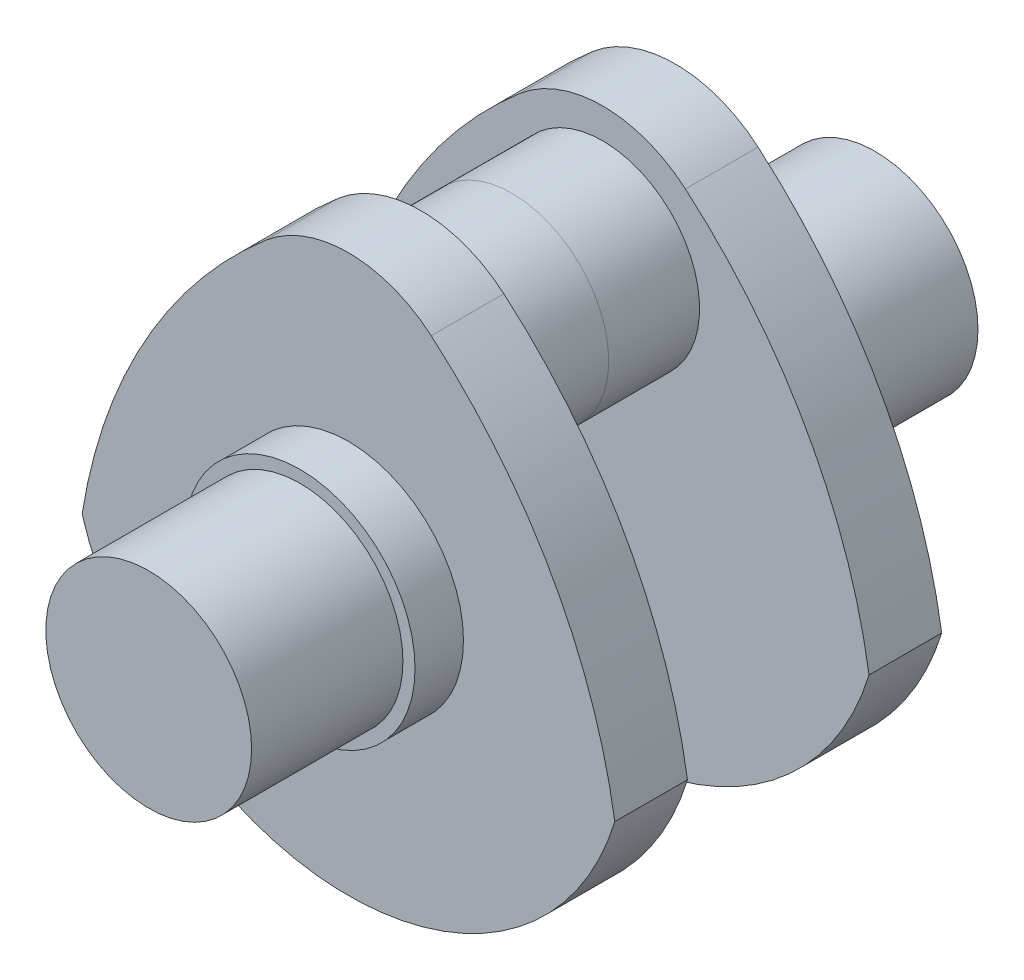
ISO-10303-21;
HEADER;
FILE_DESCRIPTION(('STEP AP214'),'2;1');
FILE_NAME('part.step','',(''),(''),'','','');
FILE_SCHEMA(('AUTOMOTIVE_DESIGN { 1 0 10303 214 1 1 1 1 }'));
ENDSEC;
DATA;
#1=APPLICATION_CONTEXT('core data for automotive mechanical design processes');
#2=APPLICATION_PROTOCOL_DEFINITION('international standard','automotive_design',2000,#1);
#3=PRODUCT_CONTEXT('',#1,'mechanical');
#4=PRODUCT('Part','Part','',(#3));
#5=PRODUCT_RELATED_PRODUCT_CATEGORY('part','',(#4));
#6=PRODUCT_DEFINITION_FORMATION('','',#4);
#7=PRODUCT_DEFINITION_CONTEXT('part definition',#1,'design');
#8=PRODUCT_DEFINITION('design','',#6,#7);
#9=PRODUCT_DEFINITION_SHAPE('','',#8);
#10=(LENGTH_UNIT() NAMED_UNIT(*) SI_UNIT(.MILLI.,.METRE.));
#11=(NAMED_UNIT(*) PLANE_ANGLE_UNIT() SI_UNIT($,.RADIAN.));
#12=(NAMED_UNIT(*) SI_UNIT($,.STERADIAN.) SOLID_ANGLE_UNIT());
#13=UNCERTAINTY_MEASURE_WITH_UNIT(LENGTH_MEASURE(1.E-05),#10,'distance_accuracy_value','');
#14=(GEOMETRIC_REPRESENTATION_CONTEXT(3) GLOBAL_UNCERTAINTY_ASSIGNED_CONTEXT((#13)) GLOBAL_UNIT_ASSIGNED_CONTEXT((#10,
#11,#12)) REPRESENTATION_CONTEXT('',''));
#15=CARTESIAN_POINT('',(0.,0.,0.));
#16=DIRECTION('',(0.,0.,1.));
#17=DIRECTION('',(1.,0.,0.));
#18=AXIS2_PLACEMENT_3D('',#15,#16,#17);
#19=CARTESIAN_POINT('',(0.,0.,-87.));
#20=DIRECTION('',(0.,0.,1.));
#21=DIRECTION('',(-1.,0.,0.));
#22=AXIS2_PLACEMENT_3D('',#19,#20,#21);
#23=CYLINDRICAL_SURFACE('',#22,17.);
#24=CARTESIAN_POINT('',(0.,0.,-62.));
#25=DIRECTION('',(0.,0.,1.));
#26=DIRECTION('',(1.,0.,0.));
#27=AXIS2_PLACEMENT_3D('',#24,#25,#26);
#28=CIRCLE('',#27,17.);
#29=CARTESIAN_POINT('',(17.,0.,-62.));
#30=VERTEX_POINT('',#29);
#31=EDGE_CURVE('E50',#30,#30,#28,.T.);
#32=ORIENTED_EDGE('',*,*,#31,.F.);
#33=EDGE_LOOP('',(#32));
#34=FACE_BOUND('',#33,.T.);
#35=CARTESIAN_POINT('',(0.,0.,-87.));
#36=DIRECTION('',(0.,0.,1.));
#37=DIRECTION('',(1.,0.,0.));
#38=AXIS2_PLACEMENT_3D('',#35,#36,#37);
#39=CIRCLE('',#38,17.);
#40=CARTESIAN_POINT('',(17.,0.,-87.));
#41=VERTEX_POINT('',#40);
#42=EDGE_CURVE('E12',#41,#41,#39,.T.);
#43=ORIENTED_EDGE('',*,*,#42,.T.);
#44=EDGE_LOOP('',(#43));
#45=FACE_BOUND('',#44,.T.);
#46=ADVANCED_FACE('F47',(#34,#45),#23,.T.);
#47=CARTESIAN_POINT('',(0.,0.,-87.));
#48=DIRECTION('',(0.,0.,-1.));
#49=DIRECTION('',(1.,0.,0.));
#50=AXIS2_PLACEMENT_3D('',#47,#48,#49);
#51=PLANE('',#50);
#52=ORIENTED_EDGE('',*,*,#42,.F.);
#53=EDGE_LOOP('',(#52));
#54=FACE_BOUND('',#53,.T.);
#55=ADVANCED_FACE('F137',(#54),#51,.T.);
#56=CARTESIAN_POINT('',(0.,0.,-62.));
#57=DIRECTION('',(0.,0.,1.));
#58=DIRECTION('',(-1.,0.,0.));
#59=AXIS2_PLACEMENT_3D('',#56,#57,#58);
#60=CYLINDRICAL_SURFACE('',#59,19.);
#61=CARTESIAN_POINT('',(0.,0.,-62.));
#62=DIRECTION('',(0.,0.,1.));
#63=DIRECTION('',(1.,0.,0.));
#64=AXIS2_PLACEMENT_3D('',#61,#62,#63);
#65=CIRCLE('',#64,19.);
#66=CARTESIAN_POINT('',(19.,0.,-62.));
#67=VERTEX_POINT('',#66);
#68=EDGE_CURVE('E126',#67,#67,#65,.T.);
#69=ORIENTED_EDGE('',*,*,#68,.T.);
#70=EDGE_LOOP('',(#69));
#71=FACE_BOUND('',#70,.T.);
#72=CARTESIAN_POINT('',(0.,0.,-54.));
#73=DIRECTION('',(0.,0.,1.));
#74=DIRECTION('',(1.,0.,0.));
#75=AXIS2_PLACEMENT_3D('',#72,#73,#74);
#76=CIRCLE('',#75,19.);
#77=CARTESIAN_POINT('',(19.,0.,-54.));
#78=VERTEX_POINT('',#77);
#79=EDGE_CURVE('E125',#78,#78,#76,.T.);
#80=ORIENTED_EDGE('',*,*,#79,.F.);
#81=EDGE_LOOP('',(#80));
#82=FACE_BOUND('',#81,.T.);
#83=ADVANCED_FACE('F134',(#71,#82),#60,.T.);
#84=CARTESIAN_POINT('',(0.,0.,-62.));
#85=DIRECTION('',(0.,0.,-1.));
#86=DIRECTION('',(1.,0.,0.));
#87=AXIS2_PLACEMENT_3D('',#84,#85,#86);
#88=PLANE('',#87);
#89=ORIENTED_EDGE('',*,*,#31,.T.);
#90=EDGE_LOOP('',(#89));
#91=FACE_BOUND('',#90,.T.);
#92=ORIENTED_EDGE('',*,*,#68,.F.);
#93=EDGE_LOOP('',(#92));
#94=FACE_BOUND('',#93,.T.);
#95=ADVANCED_FACE('F136',(#91,#94),#88,.T.);
#96=CARTESIAN_POINT('',(-44.9094542035734,-27.3845485151599,-42.));
#97=DIRECTION('',(0.,0.,-1.));
#98=DIRECTION('',(1.,0.,0.));
#99=AXIS2_PLACEMENT_3D('',#96,#97,#98);
#100=CYLINDRICAL_SURFACE('',#99,90.);
#101=CARTESIAN_POINT('',(-44.9094542035734,-27.3845485151599,-54.));
#102=DIRECTION('',(0.,0.,-1.));
#103=DIRECTION('',(-1.,0.,0.));
#104=AXIS2_PLACEMENT_3D('',#101,#102,#103);
#105=CIRCLE('',#104,90.);
#106=CARTESIAN_POINT('',(13.6680947576093,40.9431234611356,-54.));
#107=VERTEX_POINT('',#106);
#108=CARTESIAN_POINT('',(44.,-13.4164078649987,-54.));
#109=VERTEX_POINT('',#108);
#110=EDGE_CURVE('E115',#107,#109,#105,.T.);
#111=ORIENTED_EDGE('',*,*,#110,.F.);
#112=DIRECTION('',(0.,0.,-1.));
#113=VECTOR('',#112,1.);
#114=CARTESIAN_POINT('',(13.6680947576093,40.9431234611356,-42.));
#115=LINE('',#114,#113);
#116=CARTESIAN_POINT('',(13.6680947576093,40.9431234611356,-42.));
#117=VERTEX_POINT('',#116);
#118=EDGE_CURVE('E114',#117,#107,#115,.T.);
#119=ORIENTED_EDGE('',*,*,#118,.F.);
#120=CARTESIAN_POINT('',(-44.9094542035734,-27.3845485151599,-42.));
#121=DIRECTION('',(0.,0.,-1.));
#122=DIRECTION('',(-1.,0.,0.));
#123=AXIS2_PLACEMENT_3D('',#120,#121,#122);
#124=CIRCLE('',#123,90.);
#125=CARTESIAN_POINT('',(44.,-13.4164078649987,-42.));
#126=VERTEX_POINT('',#125);
#127=EDGE_CURVE('E108',#117,#126,#124,.T.);
#128=ORIENTED_EDGE('',*,*,#127,.T.);
#129=DIRECTION('',(0.,0.,-1.));
#130=VECTOR('',#129,1.);
#131=CARTESIAN_POINT('',(44.,-13.4164078649987,-42.));
#132=LINE('',#131,#130);
#133=EDGE_CURVE('E102',#126,#109,#132,.T.);
#134=ORIENTED_EDGE('',*,*,#133,.T.);
#135=EDGE_LOOP('',(#111,#119,#128,#134));
#136=FACE_BOUND('',#135,.T.);
#137=ADVANCED_FACE('F144',(#136),#100,.T.);
#138=CARTESIAN_POINT('',(0.,0.,-42.));
#139=DIRECTION('',(0.,0.,-1.));
#140=DIRECTION('',(1.,0.,0.));
#141=AXIS2_PLACEMENT_3D('',#138,#139,#140);
#142=CYLINDRICAL_SURFACE('',#141,46.);
#143=CARTESIAN_POINT('',(0.,0.,-54.));
#144=DIRECTION('',(0.,0.,-1.));
#145=DIRECTION('',(-1.,0.,0.));
#146=AXIS2_PLACEMENT_3D('',#143,#144,#145);
#147=CIRCLE('',#146,46.);
#148=CARTESIAN_POINT('',(-44.,-13.4164078649987,-54.));
#149=VERTEX_POINT('',#148);
#150=EDGE_CURVE('E117',#109,#149,#147,.T.);
#151=ORIENTED_EDGE('',*,*,#150,.F.);
#152=ORIENTED_EDGE('',*,*,#133,.F.);
#153=CARTESIAN_POINT('',(0.,0.,-42.));
#154=DIRECTION('',(0.,0.,-1.));
#155=DIRECTION('',(-1.,0.,0.));
#156=AXIS2_PLACEMENT_3D('',#153,#154,#155);
#157=CIRCLE('',#156,46.);
#158=CARTESIAN_POINT('',(-44.,-13.4164078649987,-42.));
#159=VERTEX_POINT('',#158);
#160=EDGE_CURVE('E88',#126,#159,#157,.T.);
#161=ORIENTED_EDGE('',*,*,#160,.T.);
#162=DIRECTION('',(0.,0.,-1.));
#163=VECTOR('',#162,1.);
#164=CARTESIAN_POINT('',(-44.,-13.4164078649987,-42.));
#165=LINE('',#164,#163);
#166=EDGE_CURVE('E97',#159,#149,#165,.T.);
#167=ORIENTED_EDGE('',*,*,#166,.T.);
#168=EDGE_LOOP('',(#151,#152,#161,#167));
#169=FACE_BOUND('',#168,.T.);
#170=ADVANCED_FACE('F105',(#169),#142,.T.);
#171=CARTESIAN_POINT('',(44.9094542035734,-27.3845485151599,-42.));
#172=DIRECTION('',(0.,0.,-1.));
#173=DIRECTION('',(1.,0.,0.));
#174=AXIS2_PLACEMENT_3D('',#171,#172,#173);
#175=CYLINDRICAL_SURFACE('',#174,90.);
#176=CARTESIAN_POINT('',(44.9094542035734,-27.3845485151599,-54.));
#177=DIRECTION('',(0.,0.,-1.));
#178=DIRECTION('',(-1.,0.,0.));
#179=AXIS2_PLACEMENT_3D('',#176,#177,#178);
#180=CIRCLE('',#179,90.);
#181=CARTESIAN_POINT('',(-13.6680947576093,40.9431234611356,-54.));
#182=VERTEX_POINT('',#181);
#183=EDGE_CURVE('E99',#149,#182,#180,.T.);
#184=ORIENTED_EDGE('',*,*,#183,.F.);
#185=ORIENTED_EDGE('',*,*,#166,.F.);
#186=CARTESIAN_POINT('',(44.9094542035734,-27.3845485151599,-42.));
#187=DIRECTION('',(0.,0.,-1.));
#188=DIRECTION('',(-1.,0.,0.));
#189=AXIS2_PLACEMENT_3D('',#186,#187,#188);
#190=CIRCLE('',#189,90.);
#191=CARTESIAN_POINT('',(-13.6680947576093,40.9431234611356,-42.));
#192=VERTEX_POINT('',#191);
#193=EDGE_CURVE('E91',#159,#192,#190,.T.);
#194=ORIENTED_EDGE('',*,*,#193,.T.);
#195=DIRECTION('',(0.,0.,-1.));
#196=VECTOR('',#195,1.);
#197=CARTESIAN_POINT('',(-13.6680947576093,40.9431234611356,-42.));
#198=LINE('',#197,#196);
#199=EDGE_CURVE('E103',#192,#182,#198,.T.);
#200=ORIENTED_EDGE('',*,*,#199,.T.);
#201=EDGE_LOOP('',(#184,#185,#194,#200));
#202=FACE_BOUND('',#201,.T.);
#203=ADVANCED_FACE('F98',(#202),#175,.T.);
#204=CARTESIAN_POINT('',(0.,25.,-42.));
#205=DIRECTION('',(0.,0.,-1.));
#206=DIRECTION('',(1.,0.,0.));
#207=AXIS2_PLACEMENT_3D('',#204,#205,#206);
#208=CYLINDRICAL_SURFACE('',#207,21.);
#209=CARTESIAN_POINT('',(0.,25.,-54.));
#210=DIRECTION('',(0.,0.,-1.));
#211=DIRECTION('',(-1.,0.,0.));
#212=AXIS2_PLACEMENT_3D('',#209,#210,#211);
#213=CIRCLE('',#212,21.);
#214=EDGE_CURVE('E77',#182,#107,#213,.T.);
#215=ORIENTED_EDGE('',*,*,#214,.F.);
#216=ORIENTED_EDGE('',*,*,#199,.F.);
#217=CARTESIAN_POINT('',(0.,25.,-42.));
#218=DIRECTION('',(0.,0.,-1.));
#219=DIRECTION('',(-1.,0.,0.));
#220=AXIS2_PLACEMENT_3D('',#217,#218,#219);
#221=CIRCLE('',#220,21.);
#222=EDGE_CURVE('E63',#192,#117,#221,.T.);
#223=ORIENTED_EDGE('',*,*,#222,.T.);
#224=ORIENTED_EDGE('',*,*,#118,.T.);
#225=EDGE_LOOP('',(#215,#216,#223,#224));
#226=FACE_BOUND('',#225,.T.);
#227=ADVANCED_FACE('F203',(#226),#208,.T.);
#228=CARTESIAN_POINT('',(-22.4547271017867,-13.69227425758,-42.));
#229=DIRECTION('',(0.,0.,1.));
#230=DIRECTION('',(-1.,0.,0.));
#231=AXIS2_PLACEMENT_3D('',#228,#229,#230);
#232=PLANE('',#231);
#233=CARTESIAN_POINT('',(0.,25.,-42.));
#234=DIRECTION('',(0.,0.,-1.));
#235=DIRECTION('',(-1.,0.,0.));
#236=AXIS2_PLACEMENT_3D('',#233,#234,#235);
#237=CIRCLE('',#236,16.);
#238=CARTESIAN_POINT('',(-16.,25.,-42.));
#239=VERTEX_POINT('',#238);
#240=EDGE_CURVE('E275',#239,#239,#237,.T.);
#241=ORIENTED_EDGE('',*,*,#240,.T.);
#242=EDGE_LOOP('',(#241));
#243=FACE_BOUND('',#242,.T.);
#244=ORIENTED_EDGE('',*,*,#127,.F.);
#245=ORIENTED_EDGE('',*,*,#222,.F.);
#246=ORIENTED_EDGE('',*,*,#193,.F.);
#247=ORIENTED_EDGE('',*,*,#160,.F.);
#248=EDGE_LOOP('',(#244,#245,#246,#247));
#249=FACE_BOUND('',#248,.T.);
#250=ADVANCED_FACE('F93',(#243,#249),#232,.T.);
#251=CARTESIAN_POINT('',(-22.4547271017867,-13.69227425758,-54.));
#252=DIRECTION('',(0.,0.,1.));
#253=DIRECTION('',(-1.,0.,0.));
#254=AXIS2_PLACEMENT_3D('',#251,#252,#253);
#255=PLANE('',#254);
#256=ORIENTED_EDGE('',*,*,#79,.T.);
#257=EDGE_LOOP('',(#256));
#258=FACE_BOUND('',#257,.T.);
#259=ORIENTED_EDGE('',*,*,#110,.T.);
#260=ORIENTED_EDGE('',*,*,#150,.T.);
#261=ORIENTED_EDGE('',*,*,#183,.T.);
#262=ORIENTED_EDGE('',*,*,#214,.T.);
#263=EDGE_LOOP('',(#259,#260,#261,#262));
#264=FACE_BOUND('',#263,.T.);
#265=ADVANCED_FACE('F132',(#258,#264),#255,.F.);
#266=CARTESIAN_POINT('',(0.,25.,-27.));
#267=DIRECTION('',(0.,0.,-1.));
#268=DIRECTION('',(1.,0.,0.));
#269=AXIS2_PLACEMENT_3D('',#266,#267,#268);
#270=CYLINDRICAL_SURFACE('',#269,16.);
#271=CARTESIAN_POINT('',(0.,25.,-27.));
#272=DIRECTION('',(0.,0.,-1.));
#273=DIRECTION('',(-1.,0.,0.));
#274=AXIS2_PLACEMENT_3D('',#271,#272,#273);
#275=CIRCLE('',#274,16.);
#276=CARTESIAN_POINT('',(-16.,25.,-27.));
#277=VERTEX_POINT('',#276);
#278=EDGE_CURVE('E118',#277,#277,#275,.T.);
#279=ORIENTED_EDGE('',*,*,#278,.T.);
#280=EDGE_LOOP('',(#279));
#281=FACE_BOUND('',#280,.T.);
#282=ORIENTED_EDGE('',*,*,#240,.F.);
#283=EDGE_LOOP('',(#282));
#284=FACE_BOUND('',#283,.T.);
#285=ADVANCED_FACE('F232',(#281,#284),#270,.T.);
#286=CARTESIAN_POINT('',(0.,25.,-27.));
#287=DIRECTION('',(0.,0.,1.));
#288=DIRECTION('',(-1.,0.,0.));
#289=AXIS2_PLACEMENT_3D('',#286,#287,#288);
#290=PLANE('',#289);
#291=ORIENTED_EDGE('',*,*,#278,.F.);
#292=EDGE_LOOP('',(#291));
#293=FACE_BOUND('',#292,.T.);
#294=ADVANCED_FACE('F242',(#293),#290,.T.);
#295=CLOSED_SHELL('',(#46,#55,#83,#95,#137,#170,#203,#227,#250,#265,#285,#294));
#296=MANIFOLD_SOLID_BREP('B2',#295);
#297=CARTESIAN_POINT('',(0.,0.,33.));
#298=DIRECTION('',(0.,0.,-1.));
#299=DIRECTION('',(-1.,0.,0.));
#300=AXIS2_PLACEMENT_3D('',#297,#298,#299);
#301=CYLINDRICAL_SURFACE('',#300,17.);
#302=CARTESIAN_POINT('',(0.,0.,8.));
#303=DIRECTION('',(0.,0.,1.));
#304=DIRECTION('',(1.,0.,0.));
#305=AXIS2_PLACEMENT_3D('',#302,#303,#304);
#306=CIRCLE('',#305,17.);
#307=CARTESIAN_POINT('',(17.,0.,8.));
#308=VERTEX_POINT('',#307);
#309=EDGE_CURVE('E288',#308,#308,#306,.T.);
#310=ORIENTED_EDGE('',*,*,#309,.T.);
#311=EDGE_LOOP('',(#310));
#312=FACE_BOUND('',#311,.T.);
#313=CARTESIAN_POINT('',(0.,0.,33.));
#314=DIRECTION('',(0.,0.,1.));
#315=DIRECTION('',(1.,0.,0.));
#316=AXIS2_PLACEMENT_3D('',#313,#314,#315);
#317=CIRCLE('',#316,17.);
#318=CARTESIAN_POINT('',(17.,0.,33.));
#319=VERTEX_POINT('',#318);
#320=EDGE_CURVE('E45',#319,#319,#317,.T.);
#321=ORIENTED_EDGE('',*,*,#320,.F.);
#322=EDGE_LOOP('',(#321));
#323=FACE_BOUND('',#322,.T.);
#324=ADVANCED_FACE('F285',(#312,#323),#301,.T.);
#325=CARTESIAN_POINT('',(0.,0.,33.));
#326=DIRECTION('',(0.,0.,1.));
#327=DIRECTION('',(1.,0.,0.));
#328=AXIS2_PLACEMENT_3D('',#325,#326,#327);
#329=PLANE('',#328);
#330=ORIENTED_EDGE('',*,*,#320,.T.);
#331=EDGE_LOOP('',(#330));
#332=FACE_BOUND('',#331,.T.);
#333=ADVANCED_FACE('F390',(#332),#329,.T.);
#334=CARTESIAN_POINT('',(0.,0.,8.));
#335=DIRECTION('',(0.,0.,-1.));
#336=DIRECTION('',(-1.,0.,0.));
#337=AXIS2_PLACEMENT_3D('',#334,#335,#336);
#338=CYLINDRICAL_SURFACE('',#337,19.);
#339=CARTESIAN_POINT('',(0.,0.,8.));
#340=DIRECTION('',(0.,0.,1.));
#341=DIRECTION('',(1.,0.,0.));
#342=AXIS2_PLACEMENT_3D('',#339,#340,#341);
#343=CIRCLE('',#342,19.);
#344=CARTESIAN_POINT('',(19.,0.,8.));
#345=VERTEX_POINT('',#344);
#346=EDGE_CURVE('E363',#345,#345,#343,.T.);
#347=ORIENTED_EDGE('',*,*,#346,.F.);
#348=EDGE_LOOP('',(#347));
#349=FACE_BOUND('',#348,.T.);
#350=CARTESIAN_POINT('',(0.,0.,0.));
#351=DIRECTION('',(0.,0.,1.));
#352=DIRECTION('',(1.,0.,0.));
#353=AXIS2_PLACEMENT_3D('',#350,#351,#352);
#354=CIRCLE('',#353,19.);
#355=CARTESIAN_POINT('',(19.,0.,0.));
#356=VERTEX_POINT('',#355);
#357=EDGE_CURVE('E362',#356,#356,#354,.T.);
#358=ORIENTED_EDGE('',*,*,#357,.T.);
#359=EDGE_LOOP('',(#358));
#360=FACE_BOUND('',#359,.T.);
#361=ADVANCED_FACE('F369',(#349,#360),#338,.T.);
#362=CARTESIAN_POINT('',(0.,0.,8.));
#363=DIRECTION('',(0.,0.,1.));
#364=DIRECTION('',(1.,0.,0.));
#365=AXIS2_PLACEMENT_3D('',#362,#363,#364);
#366=PLANE('',#365);
#367=ORIENTED_EDGE('',*,*,#309,.F.);
#368=EDGE_LOOP('',(#367));
#369=FACE_BOUND('',#368,.T.);
#370=ORIENTED_EDGE('',*,*,#346,.T.);
#371=EDGE_LOOP('',(#370));
#372=FACE_BOUND('',#371,.T.);
#373=ADVANCED_FACE('F401',(#369,#372),#366,.T.);
#374=CARTESIAN_POINT('',(-44.9094542035734,-27.3845485151599,-12.));
#375=DIRECTION('',(0.,0.,1.));
#376=DIRECTION('',(1.,0.,0.));
#377=AXIS2_PLACEMENT_3D('',#374,#375,#376);
#378=CYLINDRICAL_SURFACE('',#377,90.);
#379=CARTESIAN_POINT('',(-44.9094542035734,-27.3845485151599,0.));
#380=DIRECTION('',(0.,0.,-1.));
#381=DIRECTION('',(-1.,0.,0.));
#382=AXIS2_PLACEMENT_3D('',#379,#380,#381);
#383=CIRCLE('',#382,90.);
#384=CARTESIAN_POINT('',(13.6680947576093,40.9431234611356,0.));
#385=VERTEX_POINT('',#384);
#386=CARTESIAN_POINT('',(44.,-13.4164078649987,0.));
#387=VERTEX_POINT('',#386);
#388=EDGE_CURVE('E352',#385,#387,#383,.T.);
#389=ORIENTED_EDGE('',*,*,#388,.T.);
#390=DIRECTION('',(0.,0.,1.));
#391=VECTOR('',#390,1.);
#392=CARTESIAN_POINT('',(44.,-13.4164078649987,-12.));
#393=LINE('',#392,#391);
#394=CARTESIAN_POINT('',(44.,-13.4164078649987,-12.));
#395=VERTEX_POINT('',#394);
#396=EDGE_CURVE('E343',#395,#387,#393,.T.);
#397=ORIENTED_EDGE('',*,*,#396,.F.);
#398=CARTESIAN_POINT('',(-44.9094542035734,-27.3845485151599,-12.));
#399=DIRECTION('',(0.,0.,-1.));
#400=DIRECTION('',(-1.,0.,0.));
#401=AXIS2_PLACEMENT_3D('',#398,#399,#400);
#402=CIRCLE('',#401,90.);
#403=CARTESIAN_POINT('',(13.6680947576093,40.9431234611356,-12.));
#404=VERTEX_POINT('',#403);
#405=EDGE_CURVE('E337',#404,#395,#402,.T.);
#406=ORIENTED_EDGE('',*,*,#405,.F.);
#407=DIRECTION('',(0.,0.,1.));
#408=VECTOR('',#407,1.);
#409=CARTESIAN_POINT('',(13.6680947576093,40.9431234611356,-12.));
#410=LINE('',#409,#408);
#411=EDGE_CURVE('E348',#404,#385,#410,.T.);
#412=ORIENTED_EDGE('',*,*,#411,.T.);
#413=EDGE_LOOP('',(#389,#397,#406,#412));
#414=FACE_BOUND('',#413,.T.);
#415=ADVANCED_FACE('F378',(#414),#378,.T.);
#416=CARTESIAN_POINT('',(0.,0.,-12.));
#417=DIRECTION('',(0.,0.,1.));
#418=DIRECTION('',(1.,0.,0.));
#419=AXIS2_PLACEMENT_3D('',#416,#417,#418);
#420=CYLINDRICAL_SURFACE('',#419,46.);
#421=CARTESIAN_POINT('',(0.,0.,0.));
#422=DIRECTION('',(0.,0.,-1.));
#423=DIRECTION('',(-1.,0.,0.));
#424=AXIS2_PLACEMENT_3D('',#421,#422,#423);
#425=CIRCLE('',#424,46.);
#426=CARTESIAN_POINT('',(-44.,-13.4164078649987,0.));
#427=VERTEX_POINT('',#426);
#428=EDGE_CURVE('E342',#387,#427,#425,.T.);
#429=ORIENTED_EDGE('',*,*,#428,.T.);
#430=DIRECTION('',(0.,0.,1.));
#431=VECTOR('',#430,1.);
#432=CARTESIAN_POINT('',(-44.,-13.4164078649987,-12.));
#433=LINE('',#432,#431);
#434=CARTESIAN_POINT('',(-44.,-13.4164078649987,-12.));
#435=VERTEX_POINT('',#434);
#436=EDGE_CURVE('E340',#435,#427,#433,.T.);
#437=ORIENTED_EDGE('',*,*,#436,.F.);
#438=CARTESIAN_POINT('',(0.,0.,-12.));
#439=DIRECTION('',(0.,0.,-1.));
#440=DIRECTION('',(-1.,0.,0.));
#441=AXIS2_PLACEMENT_3D('',#438,#439,#440);
#442=CIRCLE('',#441,46.);
#443=EDGE_CURVE('E332',#395,#435,#442,.T.);
#444=ORIENTED_EDGE('',*,*,#443,.F.);
#445=ORIENTED_EDGE('',*,*,#396,.T.);
#446=EDGE_LOOP('',(#429,#437,#444,#445));
#447=FACE_BOUND('',#446,.T.);
#448=ADVANCED_FACE('F341',(#447),#420,.T.);
#449=CARTESIAN_POINT('',(44.9094542035734,-27.3845485151599,-12.));
#450=DIRECTION('',(0.,0.,1.));
#451=DIRECTION('',(1.,0.,0.));
#452=AXIS2_PLACEMENT_3D('',#449,#450,#451);
#453=CYLINDRICAL_SURFACE('',#452,90.);
#454=CARTESIAN_POINT('',(44.9094542035734,-27.3845485151599,0.));
#455=DIRECTION('',(0.,0.,-1.));
#456=DIRECTION('',(-1.,0.,0.));
#457=AXIS2_PLACEMENT_3D('',#454,#455,#456);
#458=CIRCLE('',#457,90.);
#459=CARTESIAN_POINT('',(-13.6680947576093,40.9431234611356,0.));
#460=VERTEX_POINT('',#459);
#461=EDGE_CURVE('E318',#427,#460,#458,.T.);
#462=ORIENTED_EDGE('',*,*,#461,.T.);
#463=DIRECTION('',(0.,0.,1.));
#464=VECTOR('',#463,1.);
#465=CARTESIAN_POINT('',(-13.6680947576093,40.9431234611356,-12.));
#466=LINE('',#465,#464);
#467=CARTESIAN_POINT('',(-13.6680947576093,40.9431234611356,-12.));
#468=VERTEX_POINT('',#467);
#469=EDGE_CURVE('E344',#468,#460,#466,.T.);
#470=ORIENTED_EDGE('',*,*,#469,.F.);
#471=CARTESIAN_POINT('',(44.9094542035734,-27.3845485151599,-12.));
#472=DIRECTION('',(0.,0.,-1.));
#473=DIRECTION('',(-1.,0.,0.));
#474=AXIS2_PLACEMENT_3D('',#471,#472,#473);
#475=CIRCLE('',#474,90.);
#476=EDGE_CURVE('E335',#435,#468,#475,.T.);
#477=ORIENTED_EDGE('',*,*,#476,.F.);
#478=ORIENTED_EDGE('',*,*,#436,.T.);
#479=EDGE_LOOP('',(#462,#470,#477,#478));
#480=FACE_BOUND('',#479,.T.);
#481=ADVANCED_FACE('F346',(#480),#453,.T.);
#482=CARTESIAN_POINT('',(0.,25.,-12.));
#483=DIRECTION('',(0.,0.,1.));
#484=DIRECTION('',(1.,0.,0.));
#485=AXIS2_PLACEMENT_3D('',#482,#483,#484);
#486=CYLINDRICAL_SURFACE('',#485,21.);
#487=CARTESIAN_POINT('',(0.,25.,0.));
#488=DIRECTION('',(0.,0.,-1.));
#489=DIRECTION('',(-1.,0.,0.));
#490=AXIS2_PLACEMENT_3D('',#487,#488,#489);
#491=CIRCLE('',#490,21.);
#492=EDGE_CURVE('E324',#460,#385,#491,.T.);
#493=ORIENTED_EDGE('',*,*,#492,.T.);
#494=ORIENTED_EDGE('',*,*,#411,.F.);
#495=CARTESIAN_POINT('',(0.,25.,-12.));
#496=DIRECTION('',(0.,0.,-1.));
#497=DIRECTION('',(-1.,0.,0.));
#498=AXIS2_PLACEMENT_3D('',#495,#496,#497);
#499=CIRCLE('',#498,21.);
#500=EDGE_CURVE('E301',#468,#404,#499,.T.);
#501=ORIENTED_EDGE('',*,*,#500,.F.);
#502=ORIENTED_EDGE('',*,*,#469,.T.);
#503=EDGE_LOOP('',(#493,#494,#501,#502));
#504=FACE_BOUND('',#503,.T.);
#505=ADVANCED_FACE('F379',(#504),#486,.T.);
#506=CARTESIAN_POINT('',(-22.4547271017867,-13.69227425758,-12.));
#507=DIRECTION('',(0.,0.,-1.));
#508=DIRECTION('',(-1.,0.,0.));
#509=AXIS2_PLACEMENT_3D('',#506,#507,#508);
#510=PLANE('',#509);
#511=CARTESIAN_POINT('',(0.,25.,-12.));
#512=DIRECTION('',(0.,0.,-1.));
#513=DIRECTION('',(-1.,0.,0.));
#514=AXIS2_PLACEMENT_3D('',#511,#512,#513);
#515=CIRCLE('',#514,16.);
#516=CARTESIAN_POINT('',(-16.,25.,-12.));
#517=VERTEX_POINT('',#516);
#518=EDGE_CURVE('E514',#517,#517,#515,.T.);
#519=ORIENTED_EDGE('',*,*,#518,.F.);
#520=EDGE_LOOP('',(#519));
#521=FACE_BOUND('',#520,.T.);
#522=ORIENTED_EDGE('',*,*,#405,.T.);
#523=ORIENTED_EDGE('',*,*,#443,.T.);
#524=ORIENTED_EDGE('',*,*,#476,.T.);
#525=ORIENTED_EDGE('',*,*,#500,.T.);
#526=EDGE_LOOP('',(#522,#523,#524,#525));
#527=FACE_BOUND('',#526,.T.);
#528=ADVANCED_FACE('F333',(#521,#527),#510,.T.);
#529=CARTESIAN_POINT('',(-22.4547271017867,-13.69227425758,0.));
#530=DIRECTION('',(0.,0.,-1.));
#531=DIRECTION('',(-1.,0.,0.));
#532=AXIS2_PLACEMENT_3D('',#529,#530,#531);
#533=PLANE('',#532);
#534=ORIENTED_EDGE('',*,*,#357,.F.);
#535=EDGE_LOOP('',(#534));
#536=FACE_BOUND('',#535,.T.);
#537=ORIENTED_EDGE('',*,*,#388,.F.);
#538=ORIENTED_EDGE('',*,*,#492,.F.);
#539=ORIENTED_EDGE('',*,*,#461,.F.);
#540=ORIENTED_EDGE('',*,*,#428,.F.);
#541=EDGE_LOOP('',(#537,#538,#539,#540));
#542=FACE_BOUND('',#541,.T.);
#543=ADVANCED_FACE('F371',(#536,#542),#533,.F.);
#544=CARTESIAN_POINT('',(0.,25.,-27.));
#545=DIRECTION('',(0.,0.,1.));
#546=DIRECTION('',(1.,0.,0.));
#547=AXIS2_PLACEMENT_3D('',#544,#545,#546);
#548=CYLINDRICAL_SURFACE('',#547,16.);
#549=CARTESIAN_POINT('',(0.,25.,-27.));
#550=DIRECTION('',(0.,0.,-1.));
#551=DIRECTION('',(-1.,0.,0.));
#552=AXIS2_PLACEMENT_3D('',#549,#550,#551);
#553=CIRCLE('',#552,16.);
#554=CARTESIAN_POINT('',(-16.,25.,-27.));
#555=VERTEX_POINT('',#554);
#556=EDGE_CURVE('E355',#555,#555,#553,.T.);
#557=ORIENTED_EDGE('',*,*,#556,.F.);
#558=EDGE_LOOP('',(#557));
#559=FACE_BOUND('',#558,.T.);
#560=ORIENTED_EDGE('',*,*,#518,.T.);
#561=EDGE_LOOP('',(#560));
#562=FACE_BOUND('',#561,.T.);
#563=ADVANCED_FACE('F374',(#559,#562),#548,.T.);
#564=CARTESIAN_POINT('',(0.,25.,-27.));
#565=DIRECTION('',(0.,0.,-1.));
#566=DIRECTION('',(-1.,0.,0.));
#567=AXIS2_PLACEMENT_3D('',#564,#565,#566);
#568=PLANE('',#567);
#569=ORIENTED_EDGE('',*,*,#556,.T.);
#570=EDGE_LOOP('',(#569));
#571=FACE_BOUND('',#570,.T.);
#572=ADVANCED_FACE('F452',(#571),#568,.T.);
#573=CLOSED_SHELL('',(#324,#333,#361,#373,#415,#448,#481,#505,#528,#543,#563,#572));
#574=MANIFOLD_SOLID_BREP('B6',#573);
#575=ADVANCED_BREP_SHAPE_REPRESENTATION('',(#18,#296,#574),#14);
#576=SHAPE_DEFINITION_REPRESENTATION(#9,#575);
ENDSEC;
END-ISO-10303-21;
